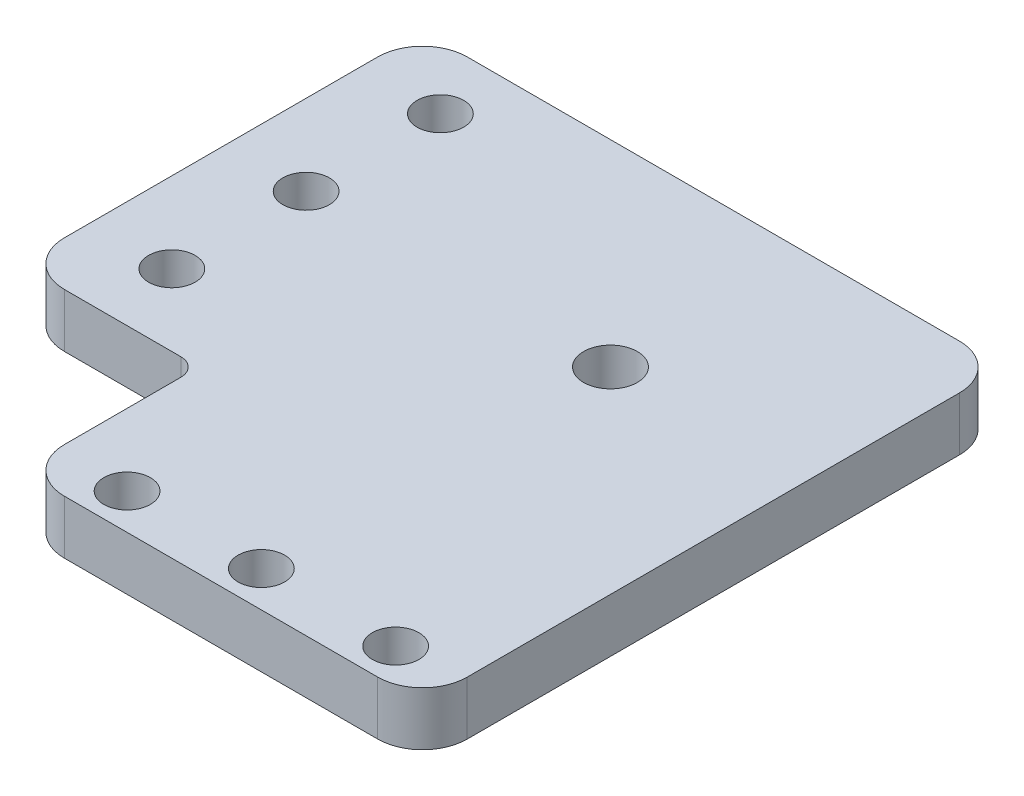
ISO-10303-21;
HEADER;
FILE_DESCRIPTION(('STEP AP214'),'2;1');
FILE_NAME('part.step','',(''),(''),'','','');
FILE_SCHEMA(('AUTOMOTIVE_DESIGN { 1 0 10303 214 1 1 1 1 }'));
ENDSEC;
DATA;
#1=APPLICATION_CONTEXT('core data for automotive mechanical design processes');
#2=APPLICATION_PROTOCOL_DEFINITION('international standard','automotive_design',2000,#1);
#3=PRODUCT_CONTEXT('',#1,'mechanical');
#4=PRODUCT('Part','Part','',(#3));
#5=PRODUCT_RELATED_PRODUCT_CATEGORY('part','',(#4));
#6=PRODUCT_DEFINITION_FORMATION('','',#4);
#7=PRODUCT_DEFINITION_CONTEXT('part definition',#1,'design');
#8=PRODUCT_DEFINITION('design','',#6,#7);
#9=PRODUCT_DEFINITION_SHAPE('','',#8);
#10=(LENGTH_UNIT() NAMED_UNIT(*) SI_UNIT(.MILLI.,.METRE.));
#11=(NAMED_UNIT(*) PLANE_ANGLE_UNIT() SI_UNIT($,.RADIAN.));
#12=(NAMED_UNIT(*) SI_UNIT($,.STERADIAN.) SOLID_ANGLE_UNIT());
#13=UNCERTAINTY_MEASURE_WITH_UNIT(LENGTH_MEASURE(1.E-05),#10,'distance_accuracy_value','');
#14=(GEOMETRIC_REPRESENTATION_CONTEXT(3) GLOBAL_UNCERTAINTY_ASSIGNED_CONTEXT((#13)) GLOBAL_UNIT_ASSIGNED_CONTEXT((#10,
#11,#12)) REPRESENTATION_CONTEXT('',''));
#15=CARTESIAN_POINT('',(0.,0.,0.));
#16=DIRECTION('',(0.,0.,1.));
#17=DIRECTION('',(1.,0.,0.));
#18=AXIS2_PLACEMENT_3D('',#15,#16,#17);
#19=CARTESIAN_POINT('',(20.,-6.,-5.));
#20=DIRECTION('',(-1.,0.,0.));
#21=DIRECTION('',(0.,0.,1.));
#22=AXIS2_PLACEMENT_3D('',#19,#20,#21);
#23=PLANE('',#22);
#24=DIRECTION('',(0.,0.,1.));
#25=VECTOR('',#24,1.);
#26=CARTESIAN_POINT('',(20.,0.,-5.));
#27=LINE('',#26,#25);
#28=CARTESIAN_POINT('',(20.,0.,-23.));
#29=VERTEX_POINT('',#28);
#30=CARTESIAN_POINT('',(20.,0.,-10.));
#31=VERTEX_POINT('',#30);
#32=EDGE_CURVE('E216',#29,#31,#27,.T.);
#33=ORIENTED_EDGE('',*,*,#32,.F.);
#34=DIRECTION('',(0.,1.,0.));
#35=VECTOR('',#34,1.);
#36=CARTESIAN_POINT('',(20.,-6.,-23.));
#37=LINE('',#36,#35);
#38=CARTESIAN_POINT('',(20.,-6.,-23.));
#39=VERTEX_POINT('',#38);
#40=EDGE_CURVE('E59',#29,#39,#37,.F.);
#41=ORIENTED_EDGE('',*,*,#40,.T.);
#42=DIRECTION('',(0.,0.,1.));
#43=VECTOR('',#42,1.);
#44=CARTESIAN_POINT('',(20.,-6.,-5.));
#45=LINE('',#44,#43);
#46=CARTESIAN_POINT('',(20.,-6.,-10.));
#47=VERTEX_POINT('',#46);
#48=EDGE_CURVE('E207',#39,#47,#45,.T.);
#49=ORIENTED_EDGE('',*,*,#48,.T.);
#50=DIRECTION('',(0.,1.,0.));
#51=VECTOR('',#50,1.);
#52=CARTESIAN_POINT('',(20.,-6.,-10.));
#53=LINE('',#52,#51);
#54=EDGE_CURVE('E183',#47,#31,#53,.T.);
#55=ORIENTED_EDGE('',*,*,#54,.T.);
#56=EDGE_LOOP('',(#33,#41,#49,#55));
#57=FACE_BOUND('',#56,.T.);
#58=ADVANCED_FACE('F38',(#57),#23,.T.);
#59=CARTESIAN_POINT('',(20.,-6.,-25.));
#60=DIRECTION('',(0.,0.,1.));
#61=DIRECTION('',(1.,0.,0.));
#62=AXIS2_PLACEMENT_3D('',#59,#60,#61);
#63=PLANE('',#62);
#64=DIRECTION('',(1.,0.,0.));
#65=VECTOR('',#64,1.);
#66=CARTESIAN_POINT('',(20.,-6.,-25.));
#67=LINE('',#66,#65);
#68=CARTESIAN_POINT('',(5.,-6.,-25.));
#69=VERTEX_POINT('',#68);
#70=CARTESIAN_POINT('',(18.,-6.,-25.));
#71=VERTEX_POINT('',#70);
#72=EDGE_CURVE('E150',#69,#71,#67,.T.);
#73=ORIENTED_EDGE('',*,*,#72,.T.);
#74=DIRECTION('',(0.,1.,0.));
#75=VECTOR('',#74,1.);
#76=CARTESIAN_POINT('',(18.,0.,-25.));
#77=LINE('',#76,#75);
#78=CARTESIAN_POINT('',(18.,0.,-25.));
#79=VERTEX_POINT('',#78);
#80=EDGE_CURVE('E195',#71,#79,#77,.T.);
#81=ORIENTED_EDGE('',*,*,#80,.T.);
#82=DIRECTION('',(1.,0.,0.));
#83=VECTOR('',#82,1.);
#84=CARTESIAN_POINT('',(20.,0.,-25.));
#85=LINE('',#84,#83);
#86=CARTESIAN_POINT('',(5.,0.,-25.));
#87=VERTEX_POINT('',#86);
#88=EDGE_CURVE('E157',#87,#79,#85,.T.);
#89=ORIENTED_EDGE('',*,*,#88,.F.);
#90=DIRECTION('',(0.,1.,0.));
#91=VECTOR('',#90,1.);
#92=CARTESIAN_POINT('',(5.,-6.,-25.));
#93=LINE('',#92,#91);
#94=EDGE_CURVE('E181',#87,#69,#93,.F.);
#95=ORIENTED_EDGE('',*,*,#94,.T.);
#96=EDGE_LOOP('',(#73,#81,#89,#95));
#97=FACE_BOUND('',#96,.T.);
#98=ADVANCED_FACE('F201',(#97),#63,.T.);
#99=CARTESIAN_POINT('',(0.,-6.,-25.));
#100=DIRECTION('',(-1.,0.,0.));
#101=DIRECTION('',(0.,0.,1.));
#102=AXIS2_PLACEMENT_3D('',#99,#100,#101);
#103=PLANE('',#102);
#104=DIRECTION('',(0.,0.,1.));
#105=VECTOR('',#104,1.);
#106=CARTESIAN_POINT('',(0.,0.,-25.));
#107=LINE('',#106,#105);
#108=CARTESIAN_POINT('',(0.,0.,-65.));
#109=VERTEX_POINT('',#108);
#110=CARTESIAN_POINT('',(0.,0.,-30.));
#111=VERTEX_POINT('',#110);
#112=EDGE_CURVE('E145',#109,#111,#107,.T.);
#113=ORIENTED_EDGE('',*,*,#112,.F.);
#114=DIRECTION('',(0.,1.,0.));
#115=VECTOR('',#114,1.);
#116=CARTESIAN_POINT('',(0.,-6.,-65.));
#117=LINE('',#116,#115);
#118=CARTESIAN_POINT('',(0.,-6.,-65.));
#119=VERTEX_POINT('',#118);
#120=EDGE_CURVE('E169',#109,#119,#117,.F.);
#121=ORIENTED_EDGE('',*,*,#120,.T.);
#122=DIRECTION('',(0.,0.,1.));
#123=VECTOR('',#122,1.);
#124=CARTESIAN_POINT('',(0.,-6.,-25.));
#125=LINE('',#124,#123);
#126=CARTESIAN_POINT('',(0.,-6.,-30.));
#127=VERTEX_POINT('',#126);
#128=EDGE_CURVE('E154',#119,#127,#125,.T.);
#129=ORIENTED_EDGE('',*,*,#128,.T.);
#130=DIRECTION('',(0.,1.,0.));
#131=VECTOR('',#130,1.);
#132=CARTESIAN_POINT('',(0.,-6.,-30.));
#133=LINE('',#132,#131);
#134=EDGE_CURVE('E166',#127,#111,#133,.T.);
#135=ORIENTED_EDGE('',*,*,#134,.T.);
#136=EDGE_LOOP('',(#113,#121,#129,#135));
#137=FACE_BOUND('',#136,.T.);
#138=ADVANCED_FACE('F307',(#137),#103,.T.);
#139=CARTESIAN_POINT('',(0.,-6.,-70.));
#140=DIRECTION('',(0.,0.,-1.));
#141=DIRECTION('',(-1.,0.,0.));
#142=AXIS2_PLACEMENT_3D('',#139,#140,#141);
#143=PLANE('',#142);
#144=DIRECTION('',(-1.,0.,0.));
#145=VECTOR('',#144,1.);
#146=CARTESIAN_POINT('',(0.,-6.,-70.));
#147=LINE('',#146,#145);
#148=CARTESIAN_POINT('',(60.,-6.,-70.));
#149=VERTEX_POINT('',#148);
#150=CARTESIAN_POINT('',(4.99999999999999,-6.,-70.));
#151=VERTEX_POINT('',#150);
#152=EDGE_CURVE('E221',#149,#151,#147,.T.);
#153=ORIENTED_EDGE('',*,*,#152,.T.);
#154=DIRECTION('',(0.,1.,0.));
#155=VECTOR('',#154,1.);
#156=CARTESIAN_POINT('',(4.99999999999999,-6.,-70.));
#157=LINE('',#156,#155);
#158=CARTESIAN_POINT('',(4.99999999999999,0.,-70.));
#159=VERTEX_POINT('',#158);
#160=EDGE_CURVE('E144',#151,#159,#157,.T.);
#161=ORIENTED_EDGE('',*,*,#160,.T.);
#162=DIRECTION('',(-1.,0.,0.));
#163=VECTOR('',#162,1.);
#164=CARTESIAN_POINT('',(0.,0.,-70.));
#165=LINE('',#164,#163);
#166=CARTESIAN_POINT('',(60.,0.,-70.));
#167=VERTEX_POINT('',#166);
#168=EDGE_CURVE('E127',#167,#159,#165,.T.);
#169=ORIENTED_EDGE('',*,*,#168,.F.);
#170=DIRECTION('',(0.,1.,0.));
#171=VECTOR('',#170,1.);
#172=CARTESIAN_POINT('',(60.,-6.,-70.));
#173=LINE('',#172,#171);
#174=EDGE_CURVE('E141',#167,#149,#173,.F.);
#175=ORIENTED_EDGE('',*,*,#174,.T.);
#176=EDGE_LOOP('',(#153,#161,#169,#175));
#177=FACE_BOUND('',#176,.T.);
#178=ADVANCED_FACE('F140',(#177),#143,.T.);
#179=CARTESIAN_POINT('',(65.,-6.,-70.));
#180=DIRECTION('',(1.,0.,0.));
#181=DIRECTION('',(0.,0.,-1.));
#182=AXIS2_PLACEMENT_3D('',#179,#180,#181);
#183=PLANE('',#182);
#184=DIRECTION('',(0.,0.,-1.));
#185=VECTOR('',#184,1.);
#186=CARTESIAN_POINT('',(65.,-6.,-70.));
#187=LINE('',#186,#185);
#188=CARTESIAN_POINT('',(65.,-6.,-10.));
#189=VERTEX_POINT('',#188);
#190=CARTESIAN_POINT('',(65.,-6.,-65.));
#191=VERTEX_POINT('',#190);
#192=EDGE_CURVE('E223',#189,#191,#187,.T.);
#193=ORIENTED_EDGE('',*,*,#192,.T.);
#194=DIRECTION('',(0.,1.,0.));
#195=VECTOR('',#194,1.);
#196=CARTESIAN_POINT('',(65.,-6.,-65.));
#197=LINE('',#196,#195);
#198=CARTESIAN_POINT('',(65.,0.,-65.));
#199=VERTEX_POINT('',#198);
#200=EDGE_CURVE('E193',#191,#199,#197,.T.);
#201=ORIENTED_EDGE('',*,*,#200,.T.);
#202=DIRECTION('',(0.,0.,-1.));
#203=VECTOR('',#202,1.);
#204=CARTESIAN_POINT('',(65.,0.,-70.));
#205=LINE('',#204,#203);
#206=CARTESIAN_POINT('',(65.,0.,-10.));
#207=VERTEX_POINT('',#206);
#208=EDGE_CURVE('E129',#207,#199,#205,.T.);
#209=ORIENTED_EDGE('',*,*,#208,.F.);
#210=DIRECTION('',(0.,1.,0.));
#211=VECTOR('',#210,1.);
#212=CARTESIAN_POINT('',(65.,-6.,-10.));
#213=LINE('',#212,#211);
#214=EDGE_CURVE('E191',#207,#189,#213,.F.);
#215=ORIENTED_EDGE('',*,*,#214,.T.);
#216=EDGE_LOOP('',(#193,#201,#209,#215));
#217=FACE_BOUND('',#216,.T.);
#218=ADVANCED_FACE('F347',(#217),#183,.T.);
#219=CARTESIAN_POINT('',(65.,-6.,-5.00000000000001));
#220=DIRECTION('',(0.,0.,1.));
#221=DIRECTION('',(1.,0.,0.));
#222=AXIS2_PLACEMENT_3D('',#219,#220,#221);
#223=PLANE('',#222);
#224=DIRECTION('',(1.,0.,0.));
#225=VECTOR('',#224,1.);
#226=CARTESIAN_POINT('',(65.,0.,-5.00000000000001));
#227=LINE('',#226,#225);
#228=CARTESIAN_POINT('',(25.,0.,-5.));
#229=VERTEX_POINT('',#228);
#230=CARTESIAN_POINT('',(60.,0.,-5.00000000000001));
#231=VERTEX_POINT('',#230);
#232=EDGE_CURVE('E213',#229,#231,#227,.T.);
#233=ORIENTED_EDGE('',*,*,#232,.F.);
#234=DIRECTION('',(0.,1.,0.));
#235=VECTOR('',#234,1.);
#236=CARTESIAN_POINT('',(25.,-6.,-5.));
#237=LINE('',#236,#235);
#238=CARTESIAN_POINT('',(25.,-6.,-5.));
#239=VERTEX_POINT('',#238);
#240=EDGE_CURVE('E189',#229,#239,#237,.F.);
#241=ORIENTED_EDGE('',*,*,#240,.T.);
#242=DIRECTION('',(1.,0.,0.));
#243=VECTOR('',#242,1.);
#244=CARTESIAN_POINT('',(65.,-6.,-5.00000000000001));
#245=LINE('',#244,#243);
#246=CARTESIAN_POINT('',(60.,-6.,-5.00000000000001));
#247=VERTEX_POINT('',#246);
#248=EDGE_CURVE('E208',#239,#247,#245,.T.);
#249=ORIENTED_EDGE('',*,*,#248,.T.);
#250=DIRECTION('',(0.,1.,0.));
#251=VECTOR('',#250,1.);
#252=CARTESIAN_POINT('',(60.,-6.,-5.00000000000001));
#253=LINE('',#252,#251);
#254=EDGE_CURVE('E186',#247,#231,#253,.T.);
#255=ORIENTED_EDGE('',*,*,#254,.T.);
#256=EDGE_LOOP('',(#233,#241,#249,#255));
#257=FACE_BOUND('',#256,.T.);
#258=ADVANCED_FACE('F311',(#257),#223,.T.);
#259=CARTESIAN_POINT('',(0.,-6.,0.));
#260=DIRECTION('',(0.,1.,0.));
#261=DIRECTION('',(0.,0.,1.));
#262=AXIS2_PLACEMENT_3D('',#259,#260,#261);
#263=PLANE('',#262);
#264=CARTESIAN_POINT('',(43.,-6.,-48.));
#265=DIRECTION('',(0.,1.,0.));
#266=DIRECTION('',(0.,0.,1.));
#267=AXIS2_PLACEMENT_3D('',#264,#265,#266);
#268=CIRCLE('',#267,3.00000000000001);
#269=CARTESIAN_POINT('',(43.,-6.,-45.));
#270=VERTEX_POINT('',#269);
#271=EDGE_CURVE('E261',#270,#270,#268,.T.);
#272=ORIENTED_EDGE('',*,*,#271,.T.);
#273=EDGE_LOOP('',(#272));
#274=FACE_BOUND('',#273,.T.);
#275=CARTESIAN_POINT('',(8.99999999999984,-6.,-63.));
#276=DIRECTION('',(0.,1.,0.));
#277=DIRECTION('',(0.,0.,1.));
#278=AXIS2_PLACEMENT_3D('',#275,#276,#277);
#279=CIRCLE('',#278,2.60000000000001);
#280=CARTESIAN_POINT('',(8.99999999999984,-6.,-60.4));
#281=VERTEX_POINT('',#280);
#282=EDGE_CURVE('E255',#281,#281,#279,.T.);
#283=ORIENTED_EDGE('',*,*,#282,.T.);
#284=EDGE_LOOP('',(#283));
#285=FACE_BOUND('',#284,.T.);
#286=CARTESIAN_POINT('',(8.9999999999999,-6.,-48.));
#287=DIRECTION('',(0.,1.,0.));
#288=DIRECTION('',(0.,0.,1.));
#289=AXIS2_PLACEMENT_3D('',#286,#287,#288);
#290=CIRCLE('',#289,2.6);
#291=CARTESIAN_POINT('',(8.9999999999999,-6.,-45.4));
#292=VERTEX_POINT('',#291);
#293=EDGE_CURVE('E249',#292,#292,#290,.T.);
#294=ORIENTED_EDGE('',*,*,#293,.T.);
#295=EDGE_LOOP('',(#294));
#296=FACE_BOUND('',#295,.T.);
#297=CARTESIAN_POINT('',(9.,-6.,-33.));
#298=DIRECTION('',(0.,1.,0.));
#299=DIRECTION('',(0.,0.,1.));
#300=AXIS2_PLACEMENT_3D('',#297,#298,#299);
#301=CIRCLE('',#300,2.6);
#302=CARTESIAN_POINT('',(9.,-6.,-30.4));
#303=VERTEX_POINT('',#302);
#304=EDGE_CURVE('E243',#303,#303,#301,.T.);
#305=ORIENTED_EDGE('',*,*,#304,.T.);
#306=EDGE_LOOP('',(#305));
#307=FACE_BOUND('',#306,.T.);
#308=CARTESIAN_POINT('',(58.,-6.,-8.99999999999999));
#309=DIRECTION('',(0.,1.,0.));
#310=DIRECTION('',(0.,0.,1.));
#311=AXIS2_PLACEMENT_3D('',#308,#309,#310);
#312=CIRCLE('',#311,2.59999999999997);
#313=CARTESIAN_POINT('',(58.,-6.,-6.40000000000003));
#314=VERTEX_POINT('',#313);
#315=EDGE_CURVE('E237',#314,#314,#312,.T.);
#316=ORIENTED_EDGE('',*,*,#315,.T.);
#317=EDGE_LOOP('',(#316));
#318=FACE_BOUND('',#317,.T.);
#319=CARTESIAN_POINT('',(43.,-6.,-8.99999999999999));
#320=DIRECTION('',(0.,1.,0.));
#321=DIRECTION('',(0.,0.,1.));
#322=AXIS2_PLACEMENT_3D('',#319,#320,#321);
#323=CIRCLE('',#322,2.6);
#324=CARTESIAN_POINT('',(43.,-6.,-6.39999999999999));
#325=VERTEX_POINT('',#324);
#326=EDGE_CURVE('E231',#325,#325,#323,.T.);
#327=ORIENTED_EDGE('',*,*,#326,.T.);
#328=EDGE_LOOP('',(#327));
#329=FACE_BOUND('',#328,.T.);
#330=CARTESIAN_POINT('',(28.,-6.,-8.99999999999999));
#331=DIRECTION('',(0.,1.,0.));
#332=DIRECTION('',(0.,0.,1.));
#333=AXIS2_PLACEMENT_3D('',#330,#331,#332);
#334=CIRCLE('',#333,2.6);
#335=CARTESIAN_POINT('',(28.,-6.,-6.39999999999999));
#336=VERTEX_POINT('',#335);
#337=EDGE_CURVE('E217',#336,#336,#334,.T.);
#338=ORIENTED_EDGE('',*,*,#337,.T.);
#339=EDGE_LOOP('',(#338));
#340=FACE_BOUND('',#339,.T.);
#341=ORIENTED_EDGE('',*,*,#128,.F.);
#342=CARTESIAN_POINT('',(4.99999999999999,-6.,-65.));
#343=DIRECTION('',(0.,1.,0.));
#344=DIRECTION('',(0.,0.,1.));
#345=AXIS2_PLACEMENT_3D('',#342,#343,#344);
#346=CIRCLE('',#345,5.);
#347=EDGE_CURVE('E179',#119,#151,#346,.F.);
#348=ORIENTED_EDGE('',*,*,#347,.T.);
#349=ORIENTED_EDGE('',*,*,#152,.F.);
#350=CARTESIAN_POINT('',(60.,-6.,-65.));
#351=DIRECTION('',(0.,1.,0.));
#352=DIRECTION('',(0.,0.,1.));
#353=AXIS2_PLACEMENT_3D('',#350,#351,#352);
#354=CIRCLE('',#353,5.);
#355=EDGE_CURVE('E149',#149,#191,#354,.F.);
#356=ORIENTED_EDGE('',*,*,#355,.T.);
#357=ORIENTED_EDGE('',*,*,#192,.F.);
#358=CARTESIAN_POINT('',(60.,-6.,-10.));
#359=DIRECTION('',(0.,1.,0.));
#360=DIRECTION('',(0.,0.,1.));
#361=AXIS2_PLACEMENT_3D('',#358,#359,#360);
#362=CIRCLE('',#361,5.);
#363=EDGE_CURVE('E171',#189,#247,#362,.F.);
#364=ORIENTED_EDGE('',*,*,#363,.T.);
#365=ORIENTED_EDGE('',*,*,#248,.F.);
#366=CARTESIAN_POINT('',(25.,-6.,-10.));
#367=DIRECTION('',(0.,1.,0.));
#368=DIRECTION('',(0.,0.,1.));
#369=AXIS2_PLACEMENT_3D('',#366,#367,#368);
#370=CIRCLE('',#369,5.);
#371=EDGE_CURVE('E174',#239,#47,#370,.F.);
#372=ORIENTED_EDGE('',*,*,#371,.T.);
#373=ORIENTED_EDGE('',*,*,#48,.F.);
#374=CARTESIAN_POINT('',(18.,-6.,-23.));
#375=DIRECTION('',(0.,1.,0.));
#376=DIRECTION('',(0.,0.,1.));
#377=AXIS2_PLACEMENT_3D('',#374,#375,#376);
#378=CIRCLE('',#377,2.);
#379=EDGE_CURVE('E11',#39,#71,#378,.T.);
#380=ORIENTED_EDGE('',*,*,#379,.T.);
#381=ORIENTED_EDGE('',*,*,#72,.F.);
#382=CARTESIAN_POINT('',(5.,-6.,-30.));
#383=DIRECTION('',(0.,1.,0.));
#384=DIRECTION('',(0.,0.,1.));
#385=AXIS2_PLACEMENT_3D('',#382,#383,#384);
#386=CIRCLE('',#385,5.);
#387=EDGE_CURVE('E177',#69,#127,#386,.F.);
#388=ORIENTED_EDGE('',*,*,#387,.T.);
#389=EDGE_LOOP('',(#341,#348,#349,#356,#357,#364,#365,#372,#373,#380,#381,#388));
#390=FACE_BOUND('',#389,.T.);
#391=ADVANCED_FACE('F276',(#274,#285,#296,#307,#318,#329,#340,#390),#263,.F.);
#392=CARTESIAN_POINT('',(0.,0.,0.));
#393=DIRECTION('',(0.,1.,0.));
#394=DIRECTION('',(0.,0.,1.));
#395=AXIS2_PLACEMENT_3D('',#392,#393,#394);
#396=PLANE('',#395);
#397=CARTESIAN_POINT('',(43.,0.,-48.));
#398=DIRECTION('',(0.,1.,0.));
#399=DIRECTION('',(0.,0.,1.));
#400=AXIS2_PLACEMENT_3D('',#397,#398,#399);
#401=CIRCLE('',#400,3.00000000000001);
#402=CARTESIAN_POINT('',(43.,0.,-45.));
#403=VERTEX_POINT('',#402);
#404=EDGE_CURVE('E266',#403,#403,#401,.T.);
#405=ORIENTED_EDGE('',*,*,#404,.F.);
#406=EDGE_LOOP('',(#405));
#407=FACE_BOUND('',#406,.T.);
#408=CARTESIAN_POINT('',(8.99999999999984,0.,-63.));
#409=DIRECTION('',(0.,1.,0.));
#410=DIRECTION('',(0.,0.,1.));
#411=AXIS2_PLACEMENT_3D('',#408,#409,#410);
#412=CIRCLE('',#411,2.60000000000001);
#413=CARTESIAN_POINT('',(8.99999999999984,0.,-60.4));
#414=VERTEX_POINT('',#413);
#415=EDGE_CURVE('E258',#414,#414,#412,.T.);
#416=ORIENTED_EDGE('',*,*,#415,.F.);
#417=EDGE_LOOP('',(#416));
#418=FACE_BOUND('',#417,.T.);
#419=CARTESIAN_POINT('',(8.9999999999999,0.,-48.));
#420=DIRECTION('',(0.,1.,0.));
#421=DIRECTION('',(0.,0.,1.));
#422=AXIS2_PLACEMENT_3D('',#419,#420,#421);
#423=CIRCLE('',#422,2.6);
#424=CARTESIAN_POINT('',(8.9999999999999,0.,-45.4));
#425=VERTEX_POINT('',#424);
#426=EDGE_CURVE('E252',#425,#425,#423,.T.);
#427=ORIENTED_EDGE('',*,*,#426,.F.);
#428=EDGE_LOOP('',(#427));
#429=FACE_BOUND('',#428,.T.);
#430=CARTESIAN_POINT('',(9.,0.,-33.));
#431=DIRECTION('',(0.,1.,0.));
#432=DIRECTION('',(0.,0.,1.));
#433=AXIS2_PLACEMENT_3D('',#430,#431,#432);
#434=CIRCLE('',#433,2.6);
#435=CARTESIAN_POINT('',(9.,0.,-30.4));
#436=VERTEX_POINT('',#435);
#437=EDGE_CURVE('E246',#436,#436,#434,.T.);
#438=ORIENTED_EDGE('',*,*,#437,.F.);
#439=EDGE_LOOP('',(#438));
#440=FACE_BOUND('',#439,.T.);
#441=CARTESIAN_POINT('',(58.,0.,-8.99999999999999));
#442=DIRECTION('',(0.,1.,0.));
#443=DIRECTION('',(0.,0.,1.));
#444=AXIS2_PLACEMENT_3D('',#441,#442,#443);
#445=CIRCLE('',#444,2.59999999999997);
#446=CARTESIAN_POINT('',(58.,0.,-6.40000000000003));
#447=VERTEX_POINT('',#446);
#448=EDGE_CURVE('E240',#447,#447,#445,.T.);
#449=ORIENTED_EDGE('',*,*,#448,.F.);
#450=EDGE_LOOP('',(#449));
#451=FACE_BOUND('',#450,.T.);
#452=CARTESIAN_POINT('',(43.,0.,-8.99999999999999));
#453=DIRECTION('',(0.,1.,0.));
#454=DIRECTION('',(0.,0.,1.));
#455=AXIS2_PLACEMENT_3D('',#452,#453,#454);
#456=CIRCLE('',#455,2.6);
#457=CARTESIAN_POINT('',(43.,0.,-6.39999999999999));
#458=VERTEX_POINT('',#457);
#459=EDGE_CURVE('E234',#458,#458,#456,.T.);
#460=ORIENTED_EDGE('',*,*,#459,.F.);
#461=EDGE_LOOP('',(#460));
#462=FACE_BOUND('',#461,.T.);
#463=CARTESIAN_POINT('',(28.,0.,-8.99999999999999));
#464=DIRECTION('',(0.,1.,0.));
#465=DIRECTION('',(0.,0.,1.));
#466=AXIS2_PLACEMENT_3D('',#463,#464,#465);
#467=CIRCLE('',#466,2.6);
#468=CARTESIAN_POINT('',(28.,0.,-6.39999999999999));
#469=VERTEX_POINT('',#468);
#470=EDGE_CURVE('E228',#469,#469,#467,.T.);
#471=ORIENTED_EDGE('',*,*,#470,.F.);
#472=EDGE_LOOP('',(#471));
#473=FACE_BOUND('',#472,.T.);
#474=ORIENTED_EDGE('',*,*,#168,.T.);
#475=CARTESIAN_POINT('',(4.99999999999999,0.,-65.));
#476=DIRECTION('',(0.,1.,0.));
#477=DIRECTION('',(0.,0.,1.));
#478=AXIS2_PLACEMENT_3D('',#475,#476,#477);
#479=CIRCLE('',#478,5.);
#480=EDGE_CURVE('E164',#159,#109,#479,.T.);
#481=ORIENTED_EDGE('',*,*,#480,.T.);
#482=ORIENTED_EDGE('',*,*,#112,.T.);
#483=CARTESIAN_POINT('',(5.,0.,-30.));
#484=DIRECTION('',(0.,1.,0.));
#485=DIRECTION('',(0.,0.,1.));
#486=AXIS2_PLACEMENT_3D('',#483,#484,#485);
#487=CIRCLE('',#486,5.);
#488=EDGE_CURVE('E162',#111,#87,#487,.T.);
#489=ORIENTED_EDGE('',*,*,#488,.T.);
#490=ORIENTED_EDGE('',*,*,#88,.T.);
#491=CARTESIAN_POINT('',(18.,0.,-23.));
#492=DIRECTION('',(0.,1.,0.));
#493=DIRECTION('',(0.,0.,1.));
#494=AXIS2_PLACEMENT_3D('',#491,#492,#493);
#495=CIRCLE('',#494,2.);
#496=EDGE_CURVE('E46',#79,#29,#495,.F.);
#497=ORIENTED_EDGE('',*,*,#496,.T.);
#498=ORIENTED_EDGE('',*,*,#32,.T.);
#499=CARTESIAN_POINT('',(25.,0.,-10.));
#500=DIRECTION('',(0.,1.,0.));
#501=DIRECTION('',(0.,0.,1.));
#502=AXIS2_PLACEMENT_3D('',#499,#500,#501);
#503=CIRCLE('',#502,5.);
#504=EDGE_CURVE('E134',#31,#229,#503,.T.);
#505=ORIENTED_EDGE('',*,*,#504,.T.);
#506=ORIENTED_EDGE('',*,*,#232,.T.);
#507=CARTESIAN_POINT('',(60.,0.,-10.));
#508=DIRECTION('',(0.,1.,0.));
#509=DIRECTION('',(0.,0.,1.));
#510=AXIS2_PLACEMENT_3D('',#507,#508,#509);
#511=CIRCLE('',#510,5.);
#512=EDGE_CURVE('E135',#231,#207,#511,.T.);
#513=ORIENTED_EDGE('',*,*,#512,.T.);
#514=ORIENTED_EDGE('',*,*,#208,.T.);
#515=CARTESIAN_POINT('',(60.,0.,-65.));
#516=DIRECTION('',(0.,1.,0.));
#517=DIRECTION('',(0.,0.,1.));
#518=AXIS2_PLACEMENT_3D('',#515,#516,#517);
#519=CIRCLE('',#518,5.);
#520=EDGE_CURVE('E124',#199,#167,#519,.T.);
#521=ORIENTED_EDGE('',*,*,#520,.T.);
#522=EDGE_LOOP('',(#474,#481,#482,#489,#490,#497,#498,#505,#506,#513,#514,#521));
#523=FACE_BOUND('',#522,.T.);
#524=ADVANCED_FACE('F126',(#407,#418,#429,#440,#451,#462,#473,#523),#396,.T.);
#525=CARTESIAN_POINT('',(28.,-6.,-8.99999999999999));
#526=DIRECTION('',(0.,1.,0.));
#527=DIRECTION('',(0.,0.,1.));
#528=AXIS2_PLACEMENT_3D('',#525,#526,#527);
#529=CYLINDRICAL_SURFACE('',#528,2.6);
#530=ORIENTED_EDGE('',*,*,#337,.F.);
#531=EDGE_LOOP('',(#530));
#532=FACE_BOUND('',#531,.T.);
#533=ORIENTED_EDGE('',*,*,#470,.T.);
#534=EDGE_LOOP('',(#533));
#535=FACE_BOUND('',#534,.T.);
#536=ADVANCED_FACE('F275',(#532,#535),#529,.F.);
#537=CARTESIAN_POINT('',(43.,-6.,-8.99999999999999));
#538=DIRECTION('',(0.,1.,0.));
#539=DIRECTION('',(0.,0.,1.));
#540=AXIS2_PLACEMENT_3D('',#537,#538,#539);
#541=CYLINDRICAL_SURFACE('',#540,2.6);
#542=ORIENTED_EDGE('',*,*,#326,.F.);
#543=EDGE_LOOP('',(#542));
#544=FACE_BOUND('',#543,.T.);
#545=ORIENTED_EDGE('',*,*,#459,.T.);
#546=EDGE_LOOP('',(#545));
#547=FACE_BOUND('',#546,.T.);
#548=ADVANCED_FACE('F291',(#544,#547),#541,.F.);
#549=CARTESIAN_POINT('',(58.,-6.,-8.99999999999999));
#550=DIRECTION('',(0.,1.,0.));
#551=DIRECTION('',(0.,0.,1.));
#552=AXIS2_PLACEMENT_3D('',#549,#550,#551);
#553=CYLINDRICAL_SURFACE('',#552,2.59999999999997);
#554=ORIENTED_EDGE('',*,*,#315,.F.);
#555=EDGE_LOOP('',(#554));
#556=FACE_BOUND('',#555,.T.);
#557=ORIENTED_EDGE('',*,*,#448,.T.);
#558=EDGE_LOOP('',(#557));
#559=FACE_BOUND('',#558,.T.);
#560=ADVANCED_FACE('F297',(#556,#559),#553,.F.);
#561=CARTESIAN_POINT('',(9.,-6.,-33.));
#562=DIRECTION('',(0.,1.,0.));
#563=DIRECTION('',(0.,0.,1.));
#564=AXIS2_PLACEMENT_3D('',#561,#562,#563);
#565=CYLINDRICAL_SURFACE('',#564,2.6);
#566=ORIENTED_EDGE('',*,*,#304,.F.);
#567=EDGE_LOOP('',(#566));
#568=FACE_BOUND('',#567,.T.);
#569=ORIENTED_EDGE('',*,*,#437,.T.);
#570=EDGE_LOOP('',(#569));
#571=FACE_BOUND('',#570,.T.);
#572=ADVANCED_FACE('F377',(#568,#571),#565,.F.);
#573=CARTESIAN_POINT('',(8.9999999999999,-6.,-48.));
#574=DIRECTION('',(0.,1.,0.));
#575=DIRECTION('',(0.,0.,1.));
#576=AXIS2_PLACEMENT_3D('',#573,#574,#575);
#577=CYLINDRICAL_SURFACE('',#576,2.6);
#578=ORIENTED_EDGE('',*,*,#293,.F.);
#579=EDGE_LOOP('',(#578));
#580=FACE_BOUND('',#579,.T.);
#581=ORIENTED_EDGE('',*,*,#426,.T.);
#582=EDGE_LOOP('',(#581));
#583=FACE_BOUND('',#582,.T.);
#584=ADVANCED_FACE('F382',(#580,#583),#577,.F.);
#585=CARTESIAN_POINT('',(8.99999999999984,-6.,-63.));
#586=DIRECTION('',(0.,1.,0.));
#587=DIRECTION('',(0.,0.,1.));
#588=AXIS2_PLACEMENT_3D('',#585,#586,#587);
#589=CYLINDRICAL_SURFACE('',#588,2.60000000000001);
#590=ORIENTED_EDGE('',*,*,#282,.F.);
#591=EDGE_LOOP('',(#590));
#592=FACE_BOUND('',#591,.T.);
#593=ORIENTED_EDGE('',*,*,#415,.T.);
#594=EDGE_LOOP('',(#593));
#595=FACE_BOUND('',#594,.T.);
#596=ADVANCED_FACE('F317',(#592,#595),#589,.F.);
#597=CARTESIAN_POINT('',(4.99999999999999,-6.,-65.));
#598=DIRECTION('',(0.,1.,0.));
#599=DIRECTION('',(0.,0.,1.));
#600=AXIS2_PLACEMENT_3D('',#597,#598,#599);
#601=CYLINDRICAL_SURFACE('',#600,5.);
#602=ORIENTED_EDGE('',*,*,#347,.F.);
#603=ORIENTED_EDGE('',*,*,#120,.F.);
#604=ORIENTED_EDGE('',*,*,#480,.F.);
#605=ORIENTED_EDGE('',*,*,#160,.F.);
#606=EDGE_LOOP('',(#602,#603,#604,#605));
#607=FACE_BOUND('',#606,.T.);
#608=ADVANCED_FACE('F313',(#607),#601,.T.);
#609=CARTESIAN_POINT('',(5.,-6.,-30.));
#610=DIRECTION('',(0.,1.,0.));
#611=DIRECTION('',(0.,0.,1.));
#612=AXIS2_PLACEMENT_3D('',#609,#610,#611);
#613=CYLINDRICAL_SURFACE('',#612,5.);
#614=ORIENTED_EDGE('',*,*,#387,.F.);
#615=ORIENTED_EDGE('',*,*,#94,.F.);
#616=ORIENTED_EDGE('',*,*,#488,.F.);
#617=ORIENTED_EDGE('',*,*,#134,.F.);
#618=EDGE_LOOP('',(#614,#615,#616,#617));
#619=FACE_BOUND('',#618,.T.);
#620=ADVANCED_FACE('F316',(#619),#613,.T.);
#621=CARTESIAN_POINT('',(25.,-6.,-10.));
#622=DIRECTION('',(0.,1.,0.));
#623=DIRECTION('',(0.,0.,1.));
#624=AXIS2_PLACEMENT_3D('',#621,#622,#623);
#625=CYLINDRICAL_SURFACE('',#624,5.);
#626=ORIENTED_EDGE('',*,*,#371,.F.);
#627=ORIENTED_EDGE('',*,*,#240,.F.);
#628=ORIENTED_EDGE('',*,*,#504,.F.);
#629=ORIENTED_EDGE('',*,*,#54,.F.);
#630=EDGE_LOOP('',(#626,#627,#628,#629));
#631=FACE_BOUND('',#630,.T.);
#632=ADVANCED_FACE('F321',(#631),#625,.T.);
#633=CARTESIAN_POINT('',(60.,-6.,-65.));
#634=DIRECTION('',(0.,1.,0.));
#635=DIRECTION('',(0.,0.,1.));
#636=AXIS2_PLACEMENT_3D('',#633,#634,#635);
#637=CYLINDRICAL_SURFACE('',#636,5.);
#638=ORIENTED_EDGE('',*,*,#355,.F.);
#639=ORIENTED_EDGE('',*,*,#174,.F.);
#640=ORIENTED_EDGE('',*,*,#520,.F.);
#641=ORIENTED_EDGE('',*,*,#200,.F.);
#642=EDGE_LOOP('',(#638,#639,#640,#641));
#643=FACE_BOUND('',#642,.T.);
#644=ADVANCED_FACE('F148',(#643),#637,.T.);
#645=CARTESIAN_POINT('',(60.,-6.,-10.));
#646=DIRECTION('',(0.,1.,0.));
#647=DIRECTION('',(0.,0.,1.));
#648=AXIS2_PLACEMENT_3D('',#645,#646,#647);
#649=CYLINDRICAL_SURFACE('',#648,5.);
#650=ORIENTED_EDGE('',*,*,#363,.F.);
#651=ORIENTED_EDGE('',*,*,#214,.F.);
#652=ORIENTED_EDGE('',*,*,#512,.F.);
#653=ORIENTED_EDGE('',*,*,#254,.F.);
#654=EDGE_LOOP('',(#650,#651,#652,#653));
#655=FACE_BOUND('',#654,.T.);
#656=ADVANCED_FACE('F327',(#655),#649,.T.);
#657=CARTESIAN_POINT('',(18.,-6.,-23.));
#658=DIRECTION('',(0.,-1.,0.));
#659=DIRECTION('',(0.,0.,-1.));
#660=AXIS2_PLACEMENT_3D('',#657,#658,#659);
#661=CYLINDRICAL_SURFACE('',#660,2.);
#662=ORIENTED_EDGE('',*,*,#379,.F.);
#663=ORIENTED_EDGE('',*,*,#40,.F.);
#664=ORIENTED_EDGE('',*,*,#496,.F.);
#665=ORIENTED_EDGE('',*,*,#80,.F.);
#666=EDGE_LOOP('',(#662,#663,#664,#665));
#667=FACE_BOUND('',#666,.T.);
#668=ADVANCED_FACE('F40',(#667),#661,.F.);
#669=CARTESIAN_POINT('',(43.,-10.,-48.));
#670=DIRECTION('',(0.,1.,0.));
#671=DIRECTION('',(0.,0.,1.));
#672=AXIS2_PLACEMENT_3D('',#669,#670,#671);
#673=CYLINDRICAL_SURFACE('',#672,3.00000000000001);
#674=ORIENTED_EDGE('',*,*,#404,.T.);
#675=EDGE_LOOP('',(#674));
#676=FACE_BOUND('',#675,.T.);
#677=ORIENTED_EDGE('',*,*,#271,.F.);
#678=EDGE_LOOP('',(#677));
#679=FACE_BOUND('',#678,.T.);
#680=ADVANCED_FACE('F270',(#676,#679),#673,.F.);
#681=CLOSED_SHELL('',(#58,#98,#138,#178,#218,#258,#391,#524,#536,#548,#560,#572,#584,#596,#608,
#620,#632,#644,#656,#668,#680));
#682=MANIFOLD_SOLID_BREP('B2',#681);
#683=ADVANCED_BREP_SHAPE_REPRESENTATION('',(#18,#682),#14);
#684=SHAPE_DEFINITION_REPRESENTATION(#9,#683);
ENDSEC;
END-ISO-10303-21;
